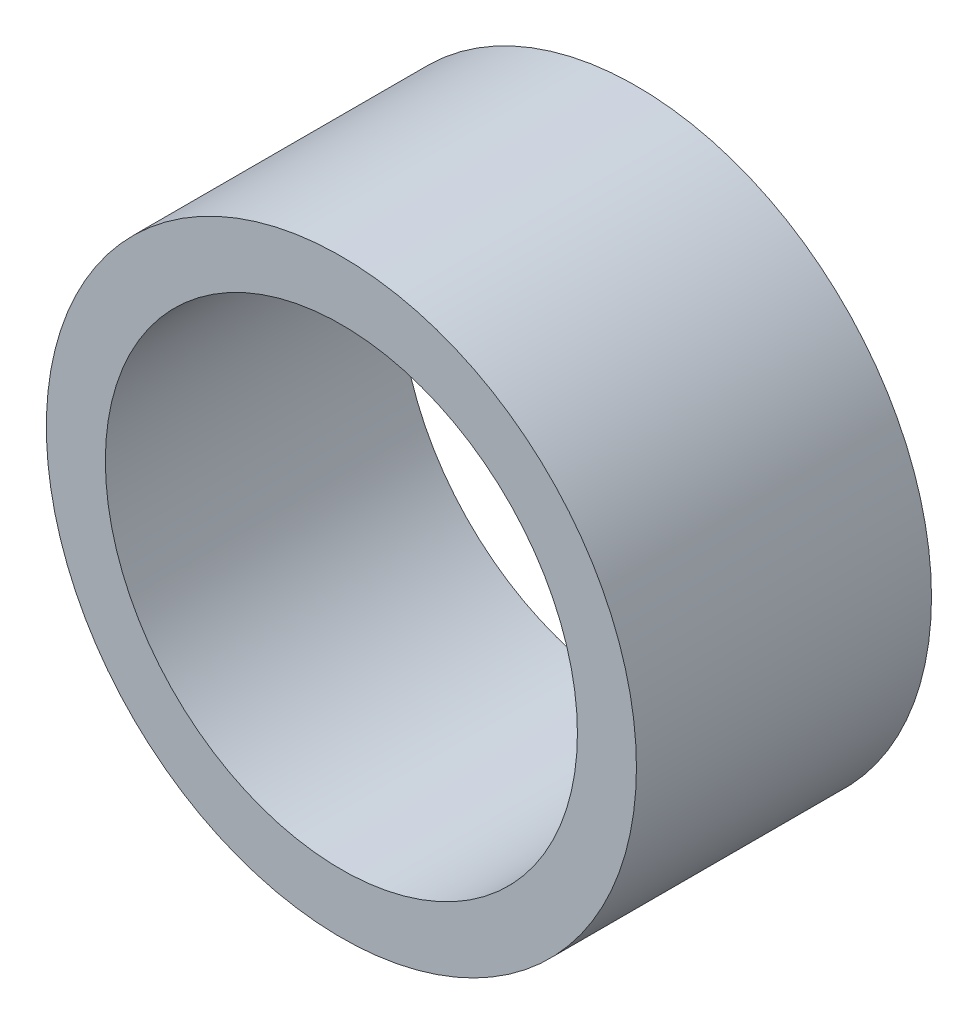
ISO-10303-21;
HEADER;
FILE_DESCRIPTION(('STEP AP214'),'2;1');
FILE_NAME('part.step','',(''),(''),'','','');
FILE_SCHEMA(('AUTOMOTIVE_DESIGN { 1 0 10303 214 1 1 1 1 }'));
ENDSEC;
DATA;
#1=APPLICATION_CONTEXT('core data for automotive mechanical design processes');
#2=APPLICATION_PROTOCOL_DEFINITION('international standard','automotive_design',2000,#1);
#3=PRODUCT_CONTEXT('',#1,'mechanical');
#4=PRODUCT('Part','Part','',(#3));
#5=PRODUCT_RELATED_PRODUCT_CATEGORY('part','',(#4));
#6=PRODUCT_DEFINITION_FORMATION('','',#4);
#7=PRODUCT_DEFINITION_CONTEXT('part definition',#1,'design');
#8=PRODUCT_DEFINITION('design','',#6,#7);
#9=PRODUCT_DEFINITION_SHAPE('','',#8);
#10=(LENGTH_UNIT() NAMED_UNIT(*) SI_UNIT(.MILLI.,.METRE.));
#11=(NAMED_UNIT(*) PLANE_ANGLE_UNIT() SI_UNIT($,.RADIAN.));
#12=(NAMED_UNIT(*) SI_UNIT($,.STERADIAN.) SOLID_ANGLE_UNIT());
#13=UNCERTAINTY_MEASURE_WITH_UNIT(LENGTH_MEASURE(1.E-05),#10,'distance_accuracy_value','');
#14=(GEOMETRIC_REPRESENTATION_CONTEXT(3) GLOBAL_UNCERTAINTY_ASSIGNED_CONTEXT((#13)) GLOBAL_UNIT_ASSIGNED_CONTEXT((#10,
#11,#12)) REPRESENTATION_CONTEXT('',''));
#15=CARTESIAN_POINT('',(0.,0.,0.));
#16=DIRECTION('',(0.,0.,1.));
#17=DIRECTION('',(1.,0.,0.));
#18=AXIS2_PLACEMENT_3D('',#15,#16,#17);
#19=CARTESIAN_POINT('',(0.,0.,12.7));
#20=DIRECTION('',(0.,0.,1.));
#21=DIRECTION('',(1.,0.,0.));
#22=AXIS2_PLACEMENT_3D('',#19,#20,#21);
#23=PLANE('',#22);
#24=CARTESIAN_POINT('',(0.,0.,12.7));
#25=DIRECTION('',(0.,0.,1.));
#26=DIRECTION('',(1.,0.,0.));
#27=AXIS2_PLACEMENT_3D('',#24,#25,#26);
#28=CIRCLE('',#27,12.7);
#29=CARTESIAN_POINT('',(12.7,0.,12.7));
#30=VERTEX_POINT('',#29);
#31=EDGE_CURVE('E10',#30,#30,#28,.T.);
#32=ORIENTED_EDGE('',*,*,#31,.T.);
#33=EDGE_LOOP('',(#32));
#34=FACE_BOUND('',#33,.T.);
#35=CARTESIAN_POINT('',(0.,0.,12.7));
#36=DIRECTION('',(0.,0.,1.));
#37=DIRECTION('',(1.,0.,0.));
#38=AXIS2_PLACEMENT_3D('',#35,#36,#37);
#39=CIRCLE('',#38,10.16);
#40=CARTESIAN_POINT('',(10.16,0.,12.7));
#41=VERTEX_POINT('',#40);
#42=EDGE_CURVE('E42',#41,#41,#39,.T.);
#43=ORIENTED_EDGE('',*,*,#42,.F.);
#44=EDGE_LOOP('',(#43));
#45=FACE_BOUND('',#44,.T.);
#46=ADVANCED_FACE('F31',(#34,#45),#23,.T.);
#47=CARTESIAN_POINT('',(0.,0.,0.));
#48=DIRECTION('',(0.,0.,1.));
#49=DIRECTION('',(1.,0.,0.));
#50=AXIS2_PLACEMENT_3D('',#47,#48,#49);
#51=PLANE('',#50);
#52=CARTESIAN_POINT('',(0.,0.,0.));
#53=DIRECTION('',(0.,0.,1.));
#54=DIRECTION('',(1.,0.,0.));
#55=AXIS2_PLACEMENT_3D('',#52,#53,#54);
#56=CIRCLE('',#55,12.7);
#57=CARTESIAN_POINT('',(12.7,0.,0.));
#58=VERTEX_POINT('',#57);
#59=EDGE_CURVE('E35',#58,#58,#56,.T.);
#60=ORIENTED_EDGE('',*,*,#59,.F.);
#61=EDGE_LOOP('',(#60));
#62=FACE_BOUND('',#61,.T.);
#63=CARTESIAN_POINT('',(0.,0.,0.));
#64=DIRECTION('',(0.,0.,1.));
#65=DIRECTION('',(1.,0.,0.));
#66=AXIS2_PLACEMENT_3D('',#63,#64,#65);
#67=CIRCLE('',#66,10.16);
#68=CARTESIAN_POINT('',(10.16,0.,0.));
#69=VERTEX_POINT('',#68);
#70=EDGE_CURVE('E44',#69,#69,#67,.T.);
#71=ORIENTED_EDGE('',*,*,#70,.T.);
#72=EDGE_LOOP('',(#71));
#73=FACE_BOUND('',#72,.T.);
#74=ADVANCED_FACE('F54',(#62,#73),#51,.F.);
#75=CARTESIAN_POINT('',(0.,0.,12.7));
#76=DIRECTION('',(0.,0.,-1.));
#77=DIRECTION('',(-1.,0.,0.));
#78=AXIS2_PLACEMENT_3D('',#75,#76,#77);
#79=CYLINDRICAL_SURFACE('',#78,12.7);
#80=ORIENTED_EDGE('',*,*,#31,.F.);
#81=EDGE_LOOP('',(#80));
#82=FACE_BOUND('',#81,.T.);
#83=ORIENTED_EDGE('',*,*,#59,.T.);
#84=EDGE_LOOP('',(#83));
#85=FACE_BOUND('',#84,.T.);
#86=ADVANCED_FACE('F33',(#82,#85),#79,.T.);
#87=CARTESIAN_POINT('',(0.,0.,12.7));
#88=DIRECTION('',(0.,0.,-1.));
#89=DIRECTION('',(-1.,0.,0.));
#90=AXIS2_PLACEMENT_3D('',#87,#88,#89);
#91=CYLINDRICAL_SURFACE('',#90,10.16);
#92=ORIENTED_EDGE('',*,*,#42,.T.);
#93=EDGE_LOOP('',(#92));
#94=FACE_BOUND('',#93,.T.);
#95=ORIENTED_EDGE('',*,*,#70,.F.);
#96=EDGE_LOOP('',(#95));
#97=FACE_BOUND('',#96,.T.);
#98=ADVANCED_FACE('F50',(#94,#97),#91,.F.);
#99=CLOSED_SHELL('',(#46,#74,#86,#98));
#100=MANIFOLD_SOLID_BREP('B2',#99);
#101=ADVANCED_BREP_SHAPE_REPRESENTATION('',(#18,#100),#14);
#102=SHAPE_DEFINITION_REPRESENTATION(#9,#101);
ENDSEC;
END-ISO-10303-21;
